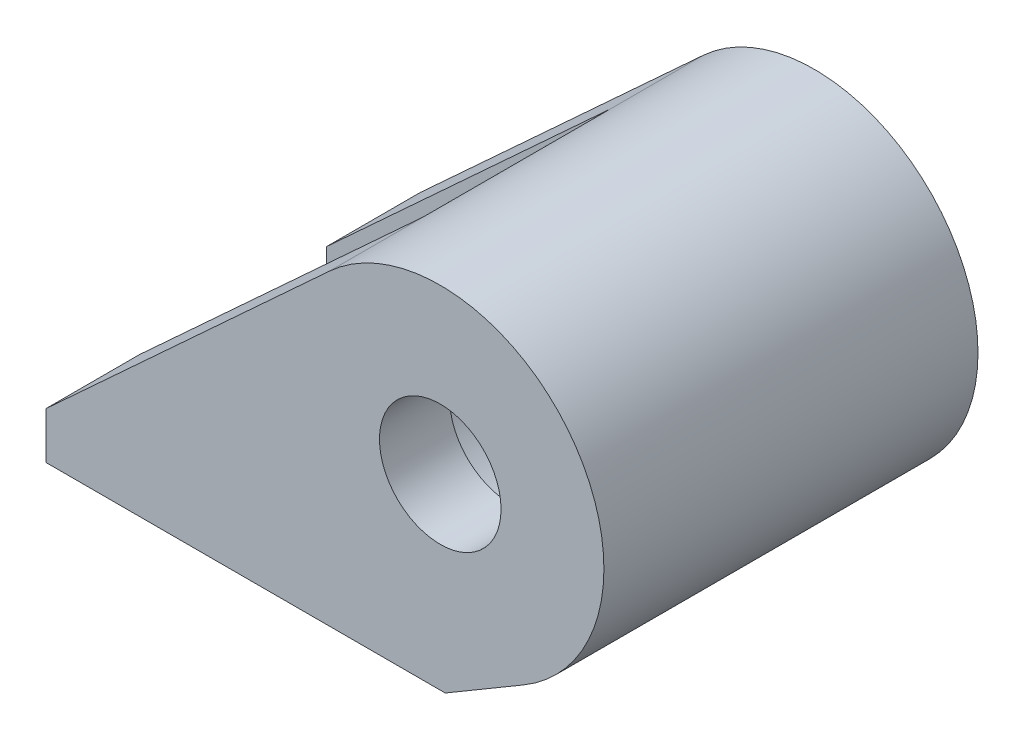
ISO-10303-21;
HEADER;
FILE_DESCRIPTION(('STEP AP214'),'2;1');
FILE_NAME('part.step','',(''),(''),'','','');
FILE_SCHEMA(('AUTOMOTIVE_DESIGN { 1 0 10303 214 1 1 1 1 }'));
ENDSEC;
DATA;
#1=APPLICATION_CONTEXT('core data for automotive mechanical design processes');
#2=APPLICATION_PROTOCOL_DEFINITION('international standard','automotive_design',2000,#1);
#3=PRODUCT_CONTEXT('',#1,'mechanical');
#4=PRODUCT('Part','Part','',(#3));
#5=PRODUCT_RELATED_PRODUCT_CATEGORY('part','',(#4));
#6=PRODUCT_DEFINITION_FORMATION('','',#4);
#7=PRODUCT_DEFINITION_CONTEXT('part definition',#1,'design');
#8=PRODUCT_DEFINITION('design','',#6,#7);
#9=PRODUCT_DEFINITION_SHAPE('','',#8);
#10=(LENGTH_UNIT() NAMED_UNIT(*) SI_UNIT(.MILLI.,.METRE.));
#11=(NAMED_UNIT(*) PLANE_ANGLE_UNIT() SI_UNIT($,.RADIAN.));
#12=(NAMED_UNIT(*) SI_UNIT($,.STERADIAN.) SOLID_ANGLE_UNIT());
#13=UNCERTAINTY_MEASURE_WITH_UNIT(LENGTH_MEASURE(1.E-05),#10,'distance_accuracy_value','');
#14=(GEOMETRIC_REPRESENTATION_CONTEXT(3) GLOBAL_UNCERTAINTY_ASSIGNED_CONTEXT((#13)) GLOBAL_UNIT_ASSIGNED_CONTEXT((#10,
#11,#12)) REPRESENTATION_CONTEXT('',''));
#15=CARTESIAN_POINT('',(0.,0.,0.));
#16=DIRECTION('',(0.,0.,1.));
#17=DIRECTION('',(1.,0.,0.));
#18=AXIS2_PLACEMENT_3D('',#15,#16,#17);
#19=CARTESIAN_POINT('',(0.,0.,15.));
#20=DIRECTION('',(0.,0.,1.));
#21=DIRECTION('',(1.,0.,0.));
#22=AXIS2_PLACEMENT_3D('',#19,#20,#21);
#23=CYLINDRICAL_SURFACE('',#22,25.);
#24=CARTESIAN_POINT('',(0.,0.,15.));
#25=DIRECTION('',(0.,0.,1.));
#26=DIRECTION('',(1.,0.,0.));
#27=AXIS2_PLACEMENT_3D('',#24,#25,#26);
#28=CIRCLE('',#27,25.);
#29=CARTESIAN_POINT('',(5.68557749527452,-24.3449010789781,15.));
#30=VERTEX_POINT('',#29);
#31=CARTESIAN_POINT('',(5.68557749527452,24.3449010789781,15.));
#32=VERTEX_POINT('',#31);
#33=EDGE_CURVE('E307',#30,#32,#28,.T.);
#34=ORIENTED_EDGE('',*,*,#33,.F.);
#35=DIRECTION('',(0.,0.,1.));
#36=VECTOR('',#35,1.);
#37=CARTESIAN_POINT('',(5.68557749527452,-24.3449010789781,15.));
#38=LINE('',#37,#36);
#39=CARTESIAN_POINT('',(5.68557749527452,-24.3449010789781,65.));
#40=VERTEX_POINT('',#39);
#41=EDGE_CURVE('E263',#30,#40,#38,.T.);
#42=ORIENTED_EDGE('',*,*,#41,.T.);
#43=CARTESIAN_POINT('',(0.,0.,65.));
#44=DIRECTION('',(0.,0.,1.));
#45=DIRECTION('',(1.,0.,0.));
#46=AXIS2_PLACEMENT_3D('',#43,#44,#45);
#47=CIRCLE('',#46,25.);
#48=CARTESIAN_POINT('',(5.68557749527452,24.3449010789781,65.));
#49=VERTEX_POINT('',#48);
#50=EDGE_CURVE('E237',#40,#49,#47,.T.);
#51=ORIENTED_EDGE('',*,*,#50,.T.);
#52=DIRECTION('',(0.,0.,1.));
#53=VECTOR('',#52,1.);
#54=CARTESIAN_POINT('',(5.68557749527452,24.3449010789781,15.));
#55=LINE('',#54,#53);
#56=EDGE_CURVE('E291',#32,#49,#55,.T.);
#57=ORIENTED_EDGE('',*,*,#56,.F.);
#58=EDGE_LOOP('',(#34,#42,#51,#57));
#59=FACE_BOUND('',#58,.T.);
#60=ADVANCED_FACE('F39',(#59),#23,.F.);
#61=CARTESIAN_POINT('',(-4.31442250472548,24.6249011866184,65.));
#62=VERTEX_POINT('',#61);
#63=CARTESIAN_POINT('',(-4.31442250472548,-24.6249011866184,65.));
#64=VERTEX_POINT('',#63);
#65=EDGE_CURVE('E308',#62,#64,#47,.T.);
#66=ORIENTED_EDGE('',*,*,#65,.T.);
#67=DIRECTION('',(0.,0.,1.));
#68=VECTOR('',#67,1.);
#69=CARTESIAN_POINT('',(-4.31442250472548,-24.6249011866184,15.));
#70=LINE('',#69,#68);
#71=CARTESIAN_POINT('',(-4.31442250472548,-24.6249011866184,15.));
#72=VERTEX_POINT('',#71);
#73=EDGE_CURVE('E259',#64,#72,#70,.F.);
#74=ORIENTED_EDGE('',*,*,#73,.T.);
#75=CARTESIAN_POINT('',(-4.31442250472548,24.6249011866184,15.));
#76=VERTEX_POINT('',#75);
#77=EDGE_CURVE('E303',#76,#72,#28,.T.);
#78=ORIENTED_EDGE('',*,*,#77,.F.);
#79=DIRECTION('',(0.,0.,1.));
#80=VECTOR('',#79,1.);
#81=CARTESIAN_POINT('',(-4.31442250472548,24.6249011866184,15.));
#82=LINE('',#81,#80);
#83=EDGE_CURVE('E288',#62,#76,#82,.F.);
#84=ORIENTED_EDGE('',*,*,#83,.F.);
#85=EDGE_LOOP('',(#66,#74,#78,#84));
#86=FACE_BOUND('',#85,.T.);
#87=ADVANCED_FACE('F547',(#86),#23,.F.);
#88=CARTESIAN_POINT('',(0.,0.,15.));
#89=DIRECTION('',(0.,0.,1.));
#90=DIRECTION('',(1.,0.,0.));
#91=AXIS2_PLACEMENT_3D('',#88,#89,#90);
#92=PLANE('',#91);
#93=DIRECTION('',(0.,1.,0.));
#94=VECTOR('',#93,1.);
#95=CARTESIAN_POINT('',(5.68557749527452,-35.,15.));
#96=LINE('',#95,#94);
#97=CARTESIAN_POINT('',(5.68557749527452,-15.,15.));
#98=VERTEX_POINT('',#97);
#99=EDGE_CURVE('E243',#30,#98,#96,.T.);
#100=ORIENTED_EDGE('',*,*,#99,.F.);
#101=ORIENTED_EDGE('',*,*,#33,.T.);
#102=DIRECTION('',(0.,-1.,0.));
#103=VECTOR('',#102,1.);
#104=CARTESIAN_POINT('',(5.68557749527452,31.,15.));
#105=LINE('',#104,#103);
#106=CARTESIAN_POINT('',(5.68557749527452,15.,15.));
#107=VERTEX_POINT('',#106);
#108=EDGE_CURVE('E284',#32,#107,#105,.T.);
#109=ORIENTED_EDGE('',*,*,#108,.T.);
#110=DIRECTION('',(-1.,0.,0.));
#111=VECTOR('',#110,1.);
#112=CARTESIAN_POINT('',(-4.31442250472548,15.,15.));
#113=LINE('',#112,#111);
#114=CARTESIAN_POINT('',(-4.31442250472548,15.,15.));
#115=VERTEX_POINT('',#114);
#116=EDGE_CURVE('E270',#107,#115,#113,.T.);
#117=ORIENTED_EDGE('',*,*,#116,.T.);
#118=DIRECTION('',(0.,-1.,0.));
#119=VECTOR('',#118,1.);
#120=CARTESIAN_POINT('',(-4.31442250472548,31.,15.));
#121=LINE('',#120,#119);
#122=EDGE_CURVE('E281',#76,#115,#121,.T.);
#123=ORIENTED_EDGE('',*,*,#122,.F.);
#124=ORIENTED_EDGE('',*,*,#77,.T.);
#125=DIRECTION('',(0.,1.,0.));
#126=VECTOR('',#125,1.);
#127=CARTESIAN_POINT('',(-4.31442250472548,-35.,15.));
#128=LINE('',#127,#126);
#129=CARTESIAN_POINT('',(-4.31442250472548,-15.,15.));
#130=VERTEX_POINT('',#129);
#131=EDGE_CURVE('E60',#72,#130,#128,.T.);
#132=ORIENTED_EDGE('',*,*,#131,.T.);
#133=DIRECTION('',(-1.,0.,0.));
#134=VECTOR('',#133,1.);
#135=CARTESIAN_POINT('',(-4.31442250472548,-15.,15.));
#136=LINE('',#135,#134);
#137=EDGE_CURVE('E55',#98,#130,#136,.T.);
#138=ORIENTED_EDGE('',*,*,#137,.F.);
#139=EDGE_LOOP('',(#100,#101,#109,#117,#123,#124,#132,#138));
#140=FACE_BOUND('',#139,.T.);
#141=CARTESIAN_POINT('',(0.,0.,15.));
#142=DIRECTION('',(0.,0.,1.));
#143=DIRECTION('',(1.,0.,0.));
#144=AXIS2_PLACEMENT_3D('',#141,#142,#143);
#145=CIRCLE('',#144,13.);
#146=CARTESIAN_POINT('',(13.,0.,15.));
#147=VERTEX_POINT('',#146);
#148=EDGE_CURVE('E295',#147,#147,#145,.T.);
#149=ORIENTED_EDGE('',*,*,#148,.F.);
#150=EDGE_LOOP('',(#149));
#151=FACE_BOUND('',#150,.T.);
#152=ADVANCED_FACE('F567',(#140,#151),#92,.T.);
#153=CARTESIAN_POINT('',(0.,0.,65.));
#154=DIRECTION('',(0.,0.,1.));
#155=DIRECTION('',(1.,0.,0.));
#156=AXIS2_PLACEMENT_3D('',#153,#154,#155);
#157=PLANE('',#156);
#158=ORIENTED_EDGE('',*,*,#50,.F.);
#159=DIRECTION('',(0.,1.,0.));
#160=VECTOR('',#159,1.);
#161=CARTESIAN_POINT('',(5.68557749527452,0.,65.));
#162=LINE('',#161,#160);
#163=CARTESIAN_POINT('',(5.68557749527452,-15.,65.));
#164=VERTEX_POINT('',#163);
#165=EDGE_CURVE('E11',#40,#164,#162,.T.);
#166=ORIENTED_EDGE('',*,*,#165,.T.);
#167=DIRECTION('',(1.,0.,0.));
#168=VECTOR('',#167,1.);
#169=CARTESIAN_POINT('',(-4.31442250472548,-15.,65.));
#170=LINE('',#169,#168);
#171=CARTESIAN_POINT('',(-4.31442250472548,-15.,65.));
#172=VERTEX_POINT('',#171);
#173=EDGE_CURVE('E234',#172,#164,#170,.T.);
#174=ORIENTED_EDGE('',*,*,#173,.F.);
#175=DIRECTION('',(0.,-1.,0.));
#176=VECTOR('',#175,1.);
#177=CARTESIAN_POINT('',(-4.31442250472548,0.,65.));
#178=LINE('',#177,#176);
#179=EDGE_CURVE('E48',#172,#64,#178,.T.);
#180=ORIENTED_EDGE('',*,*,#179,.T.);
#181=ORIENTED_EDGE('',*,*,#65,.F.);
#182=DIRECTION('',(0.,1.,0.));
#183=VECTOR('',#182,1.);
#184=CARTESIAN_POINT('',(-4.31442250472548,0.,65.));
#185=LINE('',#184,#183);
#186=CARTESIAN_POINT('',(-4.31442250472548,15.,65.));
#187=VERTEX_POINT('',#186);
#188=EDGE_CURVE('E534',#187,#62,#185,.T.);
#189=ORIENTED_EDGE('',*,*,#188,.F.);
#190=DIRECTION('',(1.,0.,0.));
#191=VECTOR('',#190,1.);
#192=CARTESIAN_POINT('',(-4.31442250472548,15.,65.));
#193=LINE('',#192,#191);
#194=CARTESIAN_POINT('',(5.68557749527452,15.,65.));
#195=VERTEX_POINT('',#194);
#196=EDGE_CURVE('E277',#187,#195,#193,.T.);
#197=ORIENTED_EDGE('',*,*,#196,.T.);
#198=DIRECTION('',(0.,-1.,0.));
#199=VECTOR('',#198,1.);
#200=CARTESIAN_POINT('',(5.68557749527452,0.,65.));
#201=LINE('',#200,#199);
#202=EDGE_CURVE('E537',#49,#195,#201,.T.);
#203=ORIENTED_EDGE('',*,*,#202,.F.);
#204=EDGE_LOOP('',(#158,#166,#174,#180,#181,#189,#197,#203));
#205=FACE_BOUND('',#204,.T.);
#206=CARTESIAN_POINT('',(0.,0.,65.));
#207=DIRECTION('',(0.,0.,1.));
#208=DIRECTION('',(1.,0.,0.));
#209=AXIS2_PLACEMENT_3D('',#206,#207,#208);
#210=CIRCLE('',#209,13.);
#211=CARTESIAN_POINT('',(13.,0.,65.));
#212=VERTEX_POINT('',#211);
#213=EDGE_CURVE('E306',#212,#212,#210,.T.);
#214=ORIENTED_EDGE('',*,*,#213,.T.);
#215=EDGE_LOOP('',(#214));
#216=FACE_BOUND('',#215,.T.);
#217=ADVANCED_FACE('F231',(#205,#216),#157,.F.);
#218=CARTESIAN_POINT('',(-84.3144225047255,-40.,20.));
#219=DIRECTION('',(0.,0.,-1.));
#220=DIRECTION('',(-1.,0.,0.));
#221=AXIS2_PLACEMENT_3D('',#218,#219,#220);
#222=PLANE('',#221);
#223=DIRECTION('',(-1.,0.,0.));
#224=VECTOR('',#223,1.);
#225=CARTESIAN_POINT('',(-64.3144225047255,-24.,20.));
#226=LINE('',#225,#224);
#227=CARTESIAN_POINT('',(-38.,-24.,20.));
#228=VERTEX_POINT('',#227);
#229=CARTESIAN_POINT('',(-64.3144225047255,-24.,20.));
#230=VERTEX_POINT('',#229);
#231=EDGE_CURVE('E383',#228,#230,#226,.T.);
#232=ORIENTED_EDGE('',*,*,#231,.F.);
#233=CARTESIAN_POINT('',(-38.,-21.,20.));
#234=DIRECTION('',(0.,0.,-1.));
#235=DIRECTION('',(-1.,0.,0.));
#236=AXIS2_PLACEMENT_3D('',#233,#234,#235);
#237=CIRCLE('',#236,3.);
#238=CARTESIAN_POINT('',(-35.,-21.,20.));
#239=VERTEX_POINT('',#238);
#240=EDGE_CURVE('E525',#228,#239,#237,.F.);
#241=ORIENTED_EDGE('',*,*,#240,.T.);
#242=DIRECTION('',(0.,-1.,0.));
#243=VECTOR('',#242,1.);
#244=CARTESIAN_POINT('',(-35.,-40.,20.));
#245=LINE('',#244,#243);
#246=CARTESIAN_POINT('',(-35.,0.,20.));
#247=VERTEX_POINT('',#246);
#248=EDGE_CURVE('E327',#247,#239,#245,.T.);
#249=ORIENTED_EDGE('',*,*,#248,.F.);
#250=CARTESIAN_POINT('',(0.,0.,20.));
#251=DIRECTION('',(0.,0.,-1.));
#252=DIRECTION('',(-1.,0.,0.));
#253=AXIS2_PLACEMENT_3D('',#250,#251,#252);
#254=CIRCLE('',#253,35.);
#255=CARTESIAN_POINT('',(-23.6945704185339,25.7598007112078,20.));
#256=VERTEX_POINT('',#255);
#257=EDGE_CURVE('E323',#256,#247,#254,.F.);
#258=ORIENTED_EDGE('',*,*,#257,.F.);
#259=DIRECTION('',(0.735994306034508,0.676987726243824,0.));
#260=VECTOR('',#259,1.);
#261=CARTESIAN_POINT('',(-84.3144225047255,-30.,20.));
#262=LINE('',#261,#260);
#263=CARTESIAN_POINT('',(-84.3144225047255,-30.,20.));
#264=VERTEX_POINT('',#263);
#265=EDGE_CURVE('E445',#264,#256,#262,.T.);
#266=ORIENTED_EDGE('',*,*,#265,.F.);
#267=DIRECTION('',(0.,1.,0.));
#268=VECTOR('',#267,1.);
#269=CARTESIAN_POINT('',(-84.3144225047255,-40.,20.));
#270=LINE('',#269,#268);
#271=CARTESIAN_POINT('',(-84.3144225047255,-40.,20.));
#272=VERTEX_POINT('',#271);
#273=EDGE_CURVE('E427',#272,#264,#270,.T.);
#274=ORIENTED_EDGE('',*,*,#273,.F.);
#275=DIRECTION('',(-1.,0.,0.));
#276=VECTOR('',#275,1.);
#277=CARTESIAN_POINT('',(-84.3144225047255,-40.,20.));
#278=LINE('',#277,#276);
#279=CARTESIAN_POINT('',(-64.3144225047255,-40.,20.));
#280=VERTEX_POINT('',#279);
#281=EDGE_CURVE('E422',#280,#272,#278,.T.);
#282=ORIENTED_EDGE('',*,*,#281,.F.);
#283=DIRECTION('',(0.,1.,0.));
#284=VECTOR('',#283,1.);
#285=CARTESIAN_POINT('',(-64.3144225047255,-40.,20.));
#286=LINE('',#285,#284);
#287=EDGE_CURVE('E432',#280,#230,#286,.T.);
#288=ORIENTED_EDGE('',*,*,#287,.T.);
#289=EDGE_LOOP('',(#232,#241,#249,#258,#266,#274,#282,#288));
#290=FACE_BOUND('',#289,.T.);
#291=ADVANCED_FACE('F613',(#290),#222,.F.);
#292=CARTESIAN_POINT('',(-84.3144225047255,-40.,60.));
#293=DIRECTION('',(0.,0.,1.));
#294=DIRECTION('',(1.,0.,0.));
#295=AXIS2_PLACEMENT_3D('',#292,#293,#294);
#296=PLANE('',#295);
#297=DIRECTION('',(0.,-1.,0.));
#298=VECTOR('',#297,1.);
#299=CARTESIAN_POINT('',(-35.,0.,60.));
#300=LINE('',#299,#298);
#301=CARTESIAN_POINT('',(-35.,0.,60.));
#302=VERTEX_POINT('',#301);
#303=CARTESIAN_POINT('',(-35.,-21.,60.));
#304=VERTEX_POINT('',#303);
#305=EDGE_CURVE('E315',#302,#304,#300,.T.);
#306=ORIENTED_EDGE('',*,*,#305,.T.);
#307=CARTESIAN_POINT('',(-38.,-21.,60.));
#308=DIRECTION('',(0.,0.,1.));
#309=DIRECTION('',(1.,0.,0.));
#310=AXIS2_PLACEMENT_3D('',#307,#308,#309);
#311=CIRCLE('',#310,3.);
#312=CARTESIAN_POINT('',(-38.,-24.,60.));
#313=VERTEX_POINT('',#312);
#314=EDGE_CURVE('E531',#304,#313,#311,.F.);
#315=ORIENTED_EDGE('',*,*,#314,.T.);
#316=DIRECTION('',(1.,0.,0.));
#317=VECTOR('',#316,1.);
#318=CARTESIAN_POINT('',(-64.3144225047255,-24.,60.));
#319=LINE('',#318,#317);
#320=CARTESIAN_POINT('',(-64.3144225047255,-24.,60.));
#321=VERTEX_POINT('',#320);
#322=EDGE_CURVE('E379',#321,#313,#319,.T.);
#323=ORIENTED_EDGE('',*,*,#322,.F.);
#324=DIRECTION('',(0.,1.,0.));
#325=VECTOR('',#324,1.);
#326=CARTESIAN_POINT('',(-64.3144225047255,-40.,60.));
#327=LINE('',#326,#325);
#328=CARTESIAN_POINT('',(-64.3144225047255,-40.,60.));
#329=VERTEX_POINT('',#328);
#330=EDGE_CURVE('E436',#329,#321,#327,.T.);
#331=ORIENTED_EDGE('',*,*,#330,.F.);
#332=DIRECTION('',(1.,0.,0.));
#333=VECTOR('',#332,1.);
#334=CARTESIAN_POINT('',(-84.3144225047255,-40.,60.));
#335=LINE('',#334,#333);
#336=CARTESIAN_POINT('',(-84.3144225047255,-40.,60.));
#337=VERTEX_POINT('',#336);
#338=EDGE_CURVE('E413',#337,#329,#335,.T.);
#339=ORIENTED_EDGE('',*,*,#338,.F.);
#340=DIRECTION('',(0.,1.,0.));
#341=VECTOR('',#340,1.);
#342=CARTESIAN_POINT('',(-84.3144225047255,-40.,60.));
#343=LINE('',#342,#341);
#344=CARTESIAN_POINT('',(-84.3144225047255,-30.,60.));
#345=VERTEX_POINT('',#344);
#346=EDGE_CURVE('E426',#337,#345,#343,.T.);
#347=ORIENTED_EDGE('',*,*,#346,.T.);
#348=DIRECTION('',(-0.735994306034508,-0.676987726243824,0.));
#349=VECTOR('',#348,1.);
#350=CARTESIAN_POINT('',(-84.3144225047255,-30.,60.));
#351=LINE('',#350,#349);
#352=CARTESIAN_POINT('',(-23.6945704185339,25.7598007112078,60.));
#353=VERTEX_POINT('',#352);
#354=EDGE_CURVE('E431',#353,#345,#351,.T.);
#355=ORIENTED_EDGE('',*,*,#354,.F.);
#356=CARTESIAN_POINT('',(0.,0.,60.));
#357=DIRECTION('',(0.,0.,1.));
#358=DIRECTION('',(1.,0.,0.));
#359=AXIS2_PLACEMENT_3D('',#356,#357,#358);
#360=CIRCLE('',#359,35.);
#361=EDGE_CURVE('E312',#353,#302,#360,.T.);
#362=ORIENTED_EDGE('',*,*,#361,.T.);
#363=EDGE_LOOP('',(#306,#315,#323,#331,#339,#347,#355,#362));
#364=FACE_BOUND('',#363,.T.);
#365=ADVANCED_FACE('F611',(#364),#296,.F.);
#366=CARTESIAN_POINT('',(-55.,-24.,40.));
#367=DIRECTION('',(0.,1.,0.));
#368=DIRECTION('',(0.,0.,1.));
#369=AXIS2_PLACEMENT_3D('',#366,#367,#368);
#370=PLANE('',#369);
#371=ORIENTED_EDGE('',*,*,#322,.T.);
#372=DIRECTION('',(0.,0.,-1.));
#373=VECTOR('',#372,1.);
#374=CARTESIAN_POINT('',(-38.,-24.,40.));
#375=LINE('',#374,#373);
#376=EDGE_CURVE('E521',#313,#228,#375,.T.);
#377=ORIENTED_EDGE('',*,*,#376,.T.);
#378=ORIENTED_EDGE('',*,*,#231,.T.);
#379=DIRECTION('',(0.,0.,1.));
#380=VECTOR('',#379,1.);
#381=CARTESIAN_POINT('',(-64.3144225047255,-24.,20.));
#382=LINE('',#381,#380);
#383=CARTESIAN_POINT('',(-64.3144225047255,-24.,25.));
#384=VERTEX_POINT('',#383);
#385=EDGE_CURVE('E514',#230,#384,#382,.T.);
#386=ORIENTED_EDGE('',*,*,#385,.T.);
#387=DIRECTION('',(-1.,0.,0.));
#388=VECTOR('',#387,1.);
#389=CARTESIAN_POINT('',(-55.,-24.,25.));
#390=LINE('',#389,#388);
#391=CARTESIAN_POINT('',(-55.,-24.,25.));
#392=VERTEX_POINT('',#391);
#393=EDGE_CURVE('E348',#392,#384,#390,.T.);
#394=ORIENTED_EDGE('',*,*,#393,.F.);
#395=CARTESIAN_POINT('',(-55.,-24.,40.));
#396=DIRECTION('',(0.,1.,0.));
#397=DIRECTION('',(0.,0.,1.));
#398=AXIS2_PLACEMENT_3D('',#395,#396,#397);
#399=CIRCLE('',#398,15.);
#400=CARTESIAN_POINT('',(-55.,-24.,55.));
#401=VERTEX_POINT('',#400);
#402=EDGE_CURVE('E331',#401,#392,#399,.T.);
#403=ORIENTED_EDGE('',*,*,#402,.F.);
#404=DIRECTION('',(1.,0.,0.));
#405=VECTOR('',#404,1.);
#406=CARTESIAN_POINT('',(-55.,-24.,55.));
#407=LINE('',#406,#405);
#408=CARTESIAN_POINT('',(-64.3144225047255,-24.,55.));
#409=VERTEX_POINT('',#408);
#410=EDGE_CURVE('E337',#409,#401,#407,.T.);
#411=ORIENTED_EDGE('',*,*,#410,.F.);
#412=EDGE_CURVE('E513',#409,#321,#382,.T.);
#413=ORIENTED_EDGE('',*,*,#412,.T.);
#414=EDGE_LOOP('',(#371,#377,#378,#386,#394,#403,#411,#413));
#415=FACE_BOUND('',#414,.T.);
#416=ADVANCED_FACE('F607',(#415),#370,.T.);
#417=CARTESIAN_POINT('',(-84.3144225047255,-30.,80.));
#418=DIRECTION('',(0.676987726243824,-0.735994306034508,0.));
#419=DIRECTION('',(0.735994306034508,0.676987726243824,0.));
#420=AXIS2_PLACEMENT_3D('',#417,#418,#419);
#421=PLANE('',#420);
#422=DIRECTION('',(0.,0.,-1.));
#423=VECTOR('',#422,1.);
#424=CARTESIAN_POINT('',(-23.6945704185339,25.7598007112078,80.));
#425=LINE('',#424,#423);
#426=CARTESIAN_POINT('',(-23.6945704185339,25.7598007112078,80.));
#427=VERTEX_POINT('',#426);
#428=EDGE_CURVE('E509',#427,#353,#425,.T.);
#429=ORIENTED_EDGE('',*,*,#428,.T.);
#430=ORIENTED_EDGE('',*,*,#354,.T.);
#431=DIRECTION('',(0.,0.,-1.));
#432=VECTOR('',#431,1.);
#433=CARTESIAN_POINT('',(-84.3144225047255,-30.,80.));
#434=LINE('',#433,#432);
#435=CARTESIAN_POINT('',(-84.3144225047255,-30.,80.));
#436=VERTEX_POINT('',#435);
#437=EDGE_CURVE('E504',#436,#345,#434,.T.);
#438=ORIENTED_EDGE('',*,*,#437,.F.);
#439=DIRECTION('',(-0.735994306034508,-0.676987726243824,0.));
#440=VECTOR('',#439,1.);
#441=CARTESIAN_POINT('',(-84.3144225047255,-30.,80.));
#442=LINE('',#441,#440);
#443=EDGE_CURVE('E461',#427,#436,#442,.T.);
#444=ORIENTED_EDGE('',*,*,#443,.F.);
#445=EDGE_LOOP('',(#429,#430,#438,#444));
#446=FACE_BOUND('',#445,.T.);
#447=ADVANCED_FACE('F610',(#446),#421,.F.);
#448=ORIENTED_EDGE('',*,*,#265,.T.);
#449=CARTESIAN_POINT('',(-23.6945704185339,25.7598007112078,0.));
#450=VERTEX_POINT('',#449);
#451=EDGE_CURVE('E508',#256,#450,#425,.T.);
#452=ORIENTED_EDGE('',*,*,#451,.T.);
#453=DIRECTION('',(-0.735994306034508,-0.676987726243824,0.));
#454=VECTOR('',#453,1.);
#455=CARTESIAN_POINT('',(-84.3144225047255,-30.,0.));
#456=LINE('',#455,#454);
#457=CARTESIAN_POINT('',(-84.3144225047255,-30.,0.));
#458=VERTEX_POINT('',#457);
#459=EDGE_CURVE('E478',#450,#458,#456,.T.);
#460=ORIENTED_EDGE('',*,*,#459,.T.);
#461=EDGE_CURVE('E503',#264,#458,#434,.T.);
#462=ORIENTED_EDGE('',*,*,#461,.F.);
#463=EDGE_LOOP('',(#448,#452,#460,#462));
#464=FACE_BOUND('',#463,.T.);
#465=ADVANCED_FACE('F597',(#464),#421,.F.);
#466=CARTESIAN_POINT('',(-55.,-40.,48.));
#467=DIRECTION('',(0.,0.,1.));
#468=DIRECTION('',(1.,0.,0.));
#469=AXIS2_PLACEMENT_3D('',#466,#467,#468);
#470=PLANE('',#469);
#471=DIRECTION('',(-1.,0.,0.));
#472=VECTOR('',#471,1.);
#473=CARTESIAN_POINT('',(-55.,-30.,48.));
#474=LINE('',#473,#472);
#475=CARTESIAN_POINT('',(-55.,-30.,48.));
#476=VERTEX_POINT('',#475);
#477=CARTESIAN_POINT('',(-64.3144225047255,-30.,48.));
#478=VERTEX_POINT('',#477);
#479=EDGE_CURVE('E362',#476,#478,#474,.T.);
#480=ORIENTED_EDGE('',*,*,#479,.F.);
#481=DIRECTION('',(0.,1.,0.));
#482=VECTOR('',#481,1.);
#483=CARTESIAN_POINT('',(-55.,-40.,48.));
#484=LINE('',#483,#482);
#485=CARTESIAN_POINT('',(-55.,-40.,48.));
#486=VERTEX_POINT('',#485);
#487=EDGE_CURVE('E399',#486,#476,#484,.T.);
#488=ORIENTED_EDGE('',*,*,#487,.F.);
#489=DIRECTION('',(1.,0.,0.));
#490=VECTOR('',#489,1.);
#491=CARTESIAN_POINT('',(-55.,-40.,48.));
#492=LINE('',#491,#490);
#493=CARTESIAN_POINT('',(-64.3144225047255,-40.,48.));
#494=VERTEX_POINT('',#493);
#495=EDGE_CURVE('E394',#494,#486,#492,.T.);
#496=ORIENTED_EDGE('',*,*,#495,.F.);
#497=DIRECTION('',(0.,-1.,0.));
#498=VECTOR('',#497,1.);
#499=CARTESIAN_POINT('',(-64.3144225047255,-40.,48.));
#500=LINE('',#499,#498);
#501=EDGE_CURVE('E410',#478,#494,#500,.T.);
#502=ORIENTED_EDGE('',*,*,#501,.F.);
#503=EDGE_LOOP('',(#480,#488,#496,#502));
#504=FACE_BOUND('',#503,.T.);
#505=ADVANCED_FACE('F593',(#504),#470,.F.);
#506=CARTESIAN_POINT('',(-92.7334325278807,-40.,32.));
#507=DIRECTION('',(0.,0.,-1.));
#508=DIRECTION('',(-1.,0.,0.));
#509=AXIS2_PLACEMENT_3D('',#506,#507,#508);
#510=PLANE('',#509);
#511=DIRECTION('',(1.,0.,0.));
#512=VECTOR('',#511,1.);
#513=CARTESIAN_POINT('',(-92.7334325278807,-30.,32.));
#514=LINE('',#513,#512);
#515=CARTESIAN_POINT('',(-64.3144225047255,-30.,32.));
#516=VERTEX_POINT('',#515);
#517=CARTESIAN_POINT('',(-55.,-30.,32.));
#518=VERTEX_POINT('',#517);
#519=EDGE_CURVE('E357',#516,#518,#514,.T.);
#520=ORIENTED_EDGE('',*,*,#519,.F.);
#521=DIRECTION('',(0.,1.,0.));
#522=VECTOR('',#521,1.);
#523=CARTESIAN_POINT('',(-64.3144225047255,-40.,32.));
#524=LINE('',#523,#522);
#525=CARTESIAN_POINT('',(-64.3144225047255,-40.,32.));
#526=VERTEX_POINT('',#525);
#527=EDGE_CURVE('E403',#526,#516,#524,.T.);
#528=ORIENTED_EDGE('',*,*,#527,.F.);
#529=DIRECTION('',(-1.,0.,0.));
#530=VECTOR('',#529,1.);
#531=CARTESIAN_POINT('',(-92.7334325278807,-40.,32.));
#532=LINE('',#531,#530);
#533=CARTESIAN_POINT('',(-55.,-40.,32.));
#534=VERTEX_POINT('',#533);
#535=EDGE_CURVE('E390',#534,#526,#532,.T.);
#536=ORIENTED_EDGE('',*,*,#535,.F.);
#537=DIRECTION('',(0.,1.,0.));
#538=VECTOR('',#537,1.);
#539=CARTESIAN_POINT('',(-55.,-40.,32.));
#540=LINE('',#539,#538);
#541=EDGE_CURVE('E398',#534,#518,#540,.T.);
#542=ORIENTED_EDGE('',*,*,#541,.T.);
#543=EDGE_LOOP('',(#520,#528,#536,#542));
#544=FACE_BOUND('',#543,.T.);
#545=ADVANCED_FACE('F596',(#544),#510,.F.);
#546=CARTESIAN_POINT('',(-55.,-40.,40.));
#547=DIRECTION('',(0.,1.,0.));
#548=DIRECTION('',(0.,0.,1.));
#549=AXIS2_PLACEMENT_3D('',#546,#547,#548);
#550=CYLINDRICAL_SURFACE('',#549,8.);
#551=CARTESIAN_POINT('',(-55.,-30.,40.));
#552=DIRECTION('',(0.,1.,0.));
#553=DIRECTION('',(0.,0.,1.));
#554=AXIS2_PLACEMENT_3D('',#551,#552,#553);
#555=CIRCLE('',#554,8.);
#556=EDGE_CURVE('E518',#518,#476,#555,.F.);
#557=ORIENTED_EDGE('',*,*,#556,.F.);
#558=ORIENTED_EDGE('',*,*,#541,.F.);
#559=CARTESIAN_POINT('',(-55.,-40.,40.));
#560=DIRECTION('',(0.,1.,0.));
#561=DIRECTION('',(0.,0.,1.));
#562=AXIS2_PLACEMENT_3D('',#559,#560,#561);
#563=CIRCLE('',#562,8.);
#564=EDGE_CURVE('E386',#486,#534,#563,.T.);
#565=ORIENTED_EDGE('',*,*,#564,.F.);
#566=ORIENTED_EDGE('',*,*,#487,.T.);
#567=EDGE_LOOP('',(#557,#558,#565,#566));
#568=FACE_BOUND('',#567,.T.);
#569=ADVANCED_FACE('F601',(#568),#550,.F.);
#570=CARTESIAN_POINT('',(-64.3144225047255,-40.,20.));
#571=DIRECTION('',(1.,0.,0.));
#572=DIRECTION('',(0.,0.,-1.));
#573=AXIS2_PLACEMENT_3D('',#570,#571,#572);
#574=PLANE('',#573);
#575=ORIENTED_EDGE('',*,*,#412,.F.);
#576=DIRECTION('',(0.,-1.,0.));
#577=VECTOR('',#576,1.);
#578=CARTESIAN_POINT('',(-64.3144225047255,-40.,55.));
#579=LINE('',#578,#577);
#580=CARTESIAN_POINT('',(-64.3144225047255,-30.,55.));
#581=VERTEX_POINT('',#580);
#582=EDGE_CURVE('E375',#409,#581,#579,.T.);
#583=ORIENTED_EDGE('',*,*,#582,.T.);
#584=DIRECTION('',(0.,0.,1.));
#585=VECTOR('',#584,1.);
#586=CARTESIAN_POINT('',(-64.3144225047255,-30.,20.));
#587=LINE('',#586,#585);
#588=EDGE_CURVE('E368',#478,#581,#587,.T.);
#589=ORIENTED_EDGE('',*,*,#588,.F.);
#590=ORIENTED_EDGE('',*,*,#501,.T.);
#591=DIRECTION('',(0.,0.,-1.));
#592=VECTOR('',#591,1.);
#593=CARTESIAN_POINT('',(-64.3144225047255,-40.,20.));
#594=LINE('',#593,#592);
#595=EDGE_CURVE('E418',#329,#494,#594,.T.);
#596=ORIENTED_EDGE('',*,*,#595,.F.);
#597=ORIENTED_EDGE('',*,*,#330,.T.);
#598=EDGE_LOOP('',(#575,#583,#589,#590,#596,#597));
#599=FACE_BOUND('',#598,.T.);
#600=ADVANCED_FACE('F605',(#599),#574,.F.);
#601=DIRECTION('',(0.,0.,1.));
#602=VECTOR('',#601,1.);
#603=CARTESIAN_POINT('',(-64.3144225047255,-30.,20.));
#604=LINE('',#603,#602);
#605=CARTESIAN_POINT('',(-64.3144225047255,-30.,25.));
#606=VERTEX_POINT('',#605);
#607=EDGE_CURVE('E365',#606,#516,#604,.T.);
#608=ORIENTED_EDGE('',*,*,#607,.F.);
#609=DIRECTION('',(0.,1.,0.));
#610=VECTOR('',#609,1.);
#611=CARTESIAN_POINT('',(-64.3144225047255,-40.,25.));
#612=LINE('',#611,#610);
#613=EDGE_CURVE('E371',#606,#384,#612,.T.);
#614=ORIENTED_EDGE('',*,*,#613,.T.);
#615=ORIENTED_EDGE('',*,*,#385,.F.);
#616=ORIENTED_EDGE('',*,*,#287,.F.);
#617=EDGE_CURVE('E417',#526,#280,#594,.T.);
#618=ORIENTED_EDGE('',*,*,#617,.F.);
#619=ORIENTED_EDGE('',*,*,#527,.T.);
#620=EDGE_LOOP('',(#608,#614,#615,#616,#618,#619));
#621=FACE_BOUND('',#620,.T.);
#622=ADVANCED_FACE('F619',(#621),#574,.F.);
#623=CARTESIAN_POINT('',(-84.3144225047255,-30.,80.));
#624=DIRECTION('',(1.,0.,0.));
#625=DIRECTION('',(0.,0.,-1.));
#626=AXIS2_PLACEMENT_3D('',#623,#624,#625);
#627=PLANE('',#626);
#628=DIRECTION('',(0.,0.,-1.));
#629=VECTOR('',#628,1.);
#630=CARTESIAN_POINT('',(-84.3144225047255,-40.,80.));
#631=LINE('',#630,#629);
#632=CARTESIAN_POINT('',(-84.3144225047255,-40.,0.));
#633=VERTEX_POINT('',#632);
#634=EDGE_CURVE('E498',#272,#633,#631,.T.);
#635=ORIENTED_EDGE('',*,*,#634,.F.);
#636=ORIENTED_EDGE('',*,*,#273,.T.);
#637=ORIENTED_EDGE('',*,*,#461,.T.);
#638=DIRECTION('',(0.,-1.,0.));
#639=VECTOR('',#638,1.);
#640=CARTESIAN_POINT('',(-84.3144225047255,-30.,0.));
#641=LINE('',#640,#639);
#642=EDGE_CURVE('E482',#458,#633,#641,.T.);
#643=ORIENTED_EDGE('',*,*,#642,.T.);
#644=EDGE_LOOP('',(#635,#636,#637,#643));
#645=FACE_BOUND('',#644,.T.);
#646=ADVANCED_FACE('F648',(#645),#627,.F.);
#647=CARTESIAN_POINT('',(0.,0.,80.));
#648=DIRECTION('',(0.,0.,-1.));
#649=DIRECTION('',(-1.,0.,0.));
#650=AXIS2_PLACEMENT_3D('',#647,#648,#649);
#651=CYLINDRICAL_SURFACE('',#650,35.);
#652=DIRECTION('',(0.,0.,-1.));
#653=VECTOR('',#652,1.);
#654=CARTESIAN_POINT('',(17.7692307692308,-30.1538461538461,80.));
#655=LINE('',#654,#653);
#656=CARTESIAN_POINT('',(17.7692307692308,-30.1538461538461,80.));
#657=VERTEX_POINT('',#656);
#658=CARTESIAN_POINT('',(17.7692307692308,-30.1538461538461,0.));
#659=VERTEX_POINT('',#658);
#660=EDGE_CURVE('E474',#657,#659,#655,.T.);
#661=ORIENTED_EDGE('',*,*,#660,.T.);
#662=CARTESIAN_POINT('',(0.,0.,0.));
#663=DIRECTION('',(0.,0.,1.));
#664=DIRECTION('',(1.,0.,0.));
#665=AXIS2_PLACEMENT_3D('',#662,#663,#664);
#666=CIRCLE('',#665,35.);
#667=EDGE_CURVE('E456',#659,#450,#666,.T.);
#668=ORIENTED_EDGE('',*,*,#667,.T.);
#669=ORIENTED_EDGE('',*,*,#451,.F.);
#670=ORIENTED_EDGE('',*,*,#257,.T.);
#671=DIRECTION('',(0.,0.,-1.));
#672=VECTOR('',#671,1.);
#673=CARTESIAN_POINT('',(-35.,0.,60.));
#674=LINE('',#673,#672);
#675=EDGE_CURVE('E319',#302,#247,#674,.T.);
#676=ORIENTED_EDGE('',*,*,#675,.F.);
#677=ORIENTED_EDGE('',*,*,#361,.F.);
#678=ORIENTED_EDGE('',*,*,#428,.F.);
#679=CARTESIAN_POINT('',(0.,0.,80.));
#680=DIRECTION('',(0.,0.,1.));
#681=DIRECTION('',(1.,0.,0.));
#682=AXIS2_PLACEMENT_3D('',#679,#680,#681);
#683=CIRCLE('',#682,35.);
#684=EDGE_CURVE('E457',#657,#427,#683,.T.);
#685=ORIENTED_EDGE('',*,*,#684,.F.);
#686=EDGE_LOOP('',(#661,#668,#669,#670,#676,#677,#678,#685));
#687=FACE_BOUND('',#686,.T.);
#688=ADVANCED_FACE('F646',(#687),#651,.T.);
#689=ORIENTED_EDGE('',*,*,#437,.T.);
#690=ORIENTED_EDGE('',*,*,#346,.F.);
#691=CARTESIAN_POINT('',(-84.3144225047255,-40.,80.));
#692=VERTEX_POINT('',#691);
#693=EDGE_CURVE('E499',#692,#337,#631,.T.);
#694=ORIENTED_EDGE('',*,*,#693,.F.);
#695=DIRECTION('',(0.,-1.,0.));
#696=VECTOR('',#695,1.);
#697=CARTESIAN_POINT('',(-84.3144225047255,-30.,80.));
#698=LINE('',#697,#696);
#699=EDGE_CURVE('E465',#436,#692,#698,.T.);
#700=ORIENTED_EDGE('',*,*,#699,.F.);
#701=EDGE_LOOP('',(#689,#690,#694,#700));
#702=FACE_BOUND('',#701,.T.);
#703=ADVANCED_FACE('F642',(#702),#627,.F.);
#704=CARTESIAN_POINT('',(-84.3144225047255,-40.,80.));
#705=DIRECTION('',(0.,1.,0.));
#706=DIRECTION('',(-1.,0.,0.));
#707=AXIS2_PLACEMENT_3D('',#704,#705,#706);
#708=PLANE('',#707);
#709=ORIENTED_EDGE('',*,*,#595,.T.);
#710=ORIENTED_EDGE('',*,*,#495,.T.);
#711=ORIENTED_EDGE('',*,*,#564,.T.);
#712=ORIENTED_EDGE('',*,*,#535,.T.);
#713=ORIENTED_EDGE('',*,*,#617,.T.);
#714=ORIENTED_EDGE('',*,*,#281,.T.);
#715=ORIENTED_EDGE('',*,*,#634,.T.);
#716=DIRECTION('',(1.,0.,0.));
#717=VECTOR('',#716,1.);
#718=CARTESIAN_POINT('',(-84.3144225047255,-40.,0.));
#719=LINE('',#718,#717);
#720=CARTESIAN_POINT('',(1.0606060606061,-40.,0.));
#721=VERTEX_POINT('',#720);
#722=EDGE_CURVE('E486',#633,#721,#719,.T.);
#723=ORIENTED_EDGE('',*,*,#722,.T.);
#724=DIRECTION('',(0.,0.,-1.));
#725=VECTOR('',#724,1.);
#726=CARTESIAN_POINT('',(1.0606060606061,-40.,80.));
#727=LINE('',#726,#725);
#728=CARTESIAN_POINT('',(1.0606060606061,-40.,80.));
#729=VERTEX_POINT('',#728);
#730=EDGE_CURVE('E494',#729,#721,#727,.T.);
#731=ORIENTED_EDGE('',*,*,#730,.F.);
#732=DIRECTION('',(1.,0.,0.));
#733=VECTOR('',#732,1.);
#734=CARTESIAN_POINT('',(-84.3144225047255,-40.,80.));
#735=LINE('',#734,#733);
#736=EDGE_CURVE('E468',#692,#729,#735,.T.);
#737=ORIENTED_EDGE('',*,*,#736,.F.);
#738=ORIENTED_EDGE('',*,*,#693,.T.);
#739=ORIENTED_EDGE('',*,*,#338,.T.);
#740=EDGE_LOOP('',(#709,#710,#711,#712,#713,#714,#715,#723,#731,#737,#738,#739));
#741=FACE_BOUND('',#740,.T.);
#742=ADVANCED_FACE('F638',(#741),#708,.F.);
#743=CARTESIAN_POINT('',(1.0606060606061,-40.,80.));
#744=DIRECTION('',(-0.507692307692308,0.861538461538461,0.));
#745=DIRECTION('',(-0.861538461538461,-0.507692307692308,0.));
#746=AXIS2_PLACEMENT_3D('',#743,#744,#745);
#747=PLANE('',#746);
#748=DIRECTION('',(0.861538461538461,0.507692307692308,0.));
#749=VECTOR('',#748,1.);
#750=CARTESIAN_POINT('',(1.0606060606061,-40.,0.));
#751=LINE('',#750,#749);
#752=EDGE_CURVE('E462',#721,#659,#751,.T.);
#753=ORIENTED_EDGE('',*,*,#752,.T.);
#754=ORIENTED_EDGE('',*,*,#660,.F.);
#755=DIRECTION('',(0.861538461538461,0.507692307692308,0.));
#756=VECTOR('',#755,1.);
#757=CARTESIAN_POINT('',(1.0606060606061,-40.,80.));
#758=LINE('',#757,#756);
#759=EDGE_CURVE('E471',#729,#657,#758,.T.);
#760=ORIENTED_EDGE('',*,*,#759,.F.);
#761=ORIENTED_EDGE('',*,*,#730,.T.);
#762=EDGE_LOOP('',(#753,#754,#760,#761));
#763=FACE_BOUND('',#762,.T.);
#764=ADVANCED_FACE('F631',(#763),#747,.F.);
#765=CARTESIAN_POINT('',(0.,0.,80.));
#766=DIRECTION('',(0.,0.,1.));
#767=DIRECTION('',(1.,0.,0.));
#768=AXIS2_PLACEMENT_3D('',#765,#766,#767);
#769=PLANE('',#768);
#770=CARTESIAN_POINT('',(0.,0.,80.));
#771=DIRECTION('',(0.,0.,1.));
#772=DIRECTION('',(1.,0.,0.));
#773=AXIS2_PLACEMENT_3D('',#770,#771,#772);
#774=CIRCLE('',#773,13.);
#775=CARTESIAN_POINT('',(13.,0.,80.));
#776=VERTEX_POINT('',#775);
#777=EDGE_CURVE('E449',#776,#776,#774,.T.);
#778=ORIENTED_EDGE('',*,*,#777,.F.);
#779=EDGE_LOOP('',(#778));
#780=FACE_BOUND('',#779,.T.);
#781=ORIENTED_EDGE('',*,*,#684,.T.);
#782=ORIENTED_EDGE('',*,*,#443,.T.);
#783=ORIENTED_EDGE('',*,*,#699,.T.);
#784=ORIENTED_EDGE('',*,*,#736,.T.);
#785=ORIENTED_EDGE('',*,*,#759,.T.);
#786=EDGE_LOOP('',(#781,#782,#783,#784,#785));
#787=FACE_BOUND('',#786,.T.);
#788=ADVANCED_FACE('F628',(#780,#787),#769,.T.);
#789=CARTESIAN_POINT('',(0.,0.,0.));
#790=DIRECTION('',(0.,0.,1.));
#791=DIRECTION('',(1.,0.,0.));
#792=AXIS2_PLACEMENT_3D('',#789,#790,#791);
#793=PLANE('',#792);
#794=CARTESIAN_POINT('',(0.,0.,0.));
#795=DIRECTION('',(0.,0.,1.));
#796=DIRECTION('',(1.,0.,0.));
#797=AXIS2_PLACEMENT_3D('',#794,#795,#796);
#798=CIRCLE('',#797,13.);
#799=CARTESIAN_POINT('',(13.,0.,0.));
#800=VERTEX_POINT('',#799);
#801=EDGE_CURVE('E299',#800,#800,#798,.T.);
#802=ORIENTED_EDGE('',*,*,#801,.T.);
#803=EDGE_LOOP('',(#802));
#804=FACE_BOUND('',#803,.T.);
#805=ORIENTED_EDGE('',*,*,#459,.F.);
#806=ORIENTED_EDGE('',*,*,#667,.F.);
#807=ORIENTED_EDGE('',*,*,#752,.F.);
#808=ORIENTED_EDGE('',*,*,#722,.F.);
#809=ORIENTED_EDGE('',*,*,#642,.F.);
#810=EDGE_LOOP('',(#805,#806,#807,#808,#809));
#811=FACE_BOUND('',#810,.T.);
#812=ADVANCED_FACE('F626',(#804,#811),#793,.F.);
#813=CARTESIAN_POINT('',(0.,0.,65.));
#814=DIRECTION('',(0.,0.,1.));
#815=DIRECTION('',(1.,0.,0.));
#816=AXIS2_PLACEMENT_3D('',#813,#814,#815);
#817=CYLINDRICAL_SURFACE('',#816,13.);
#818=ORIENTED_EDGE('',*,*,#213,.F.);
#819=EDGE_LOOP('',(#818));
#820=FACE_BOUND('',#819,.T.);
#821=ORIENTED_EDGE('',*,*,#777,.T.);
#822=EDGE_LOOP('',(#821));
#823=FACE_BOUND('',#822,.T.);
#824=ADVANCED_FACE('F585',(#820,#823),#817,.F.);
#825=CARTESIAN_POINT('',(-55.,-30.,55.));
#826=DIRECTION('',(0.,0.,1.));
#827=DIRECTION('',(1.,0.,0.));
#828=AXIS2_PLACEMENT_3D('',#825,#826,#827);
#829=PLANE('',#828);
#830=ORIENTED_EDGE('',*,*,#410,.T.);
#831=DIRECTION('',(0.,1.,0.));
#832=VECTOR('',#831,1.);
#833=CARTESIAN_POINT('',(-55.,-30.,55.));
#834=LINE('',#833,#832);
#835=CARTESIAN_POINT('',(-55.,-30.,55.));
#836=VERTEX_POINT('',#835);
#837=EDGE_CURVE('E353',#836,#401,#834,.T.);
#838=ORIENTED_EDGE('',*,*,#837,.F.);
#839=DIRECTION('',(1.,0.,0.));
#840=VECTOR('',#839,1.);
#841=CARTESIAN_POINT('',(-55.,-30.,55.));
#842=LINE('',#841,#840);
#843=EDGE_CURVE('E341',#581,#836,#842,.T.);
#844=ORIENTED_EDGE('',*,*,#843,.F.);
#845=ORIENTED_EDGE('',*,*,#582,.F.);
#846=EDGE_LOOP('',(#830,#838,#844,#845));
#847=FACE_BOUND('',#846,.T.);
#848=ADVANCED_FACE('F582',(#847),#829,.F.);
#849=CARTESIAN_POINT('',(-55.,-30.,25.));
#850=DIRECTION('',(0.,0.,-1.));
#851=DIRECTION('',(-1.,0.,0.));
#852=AXIS2_PLACEMENT_3D('',#849,#850,#851);
#853=PLANE('',#852);
#854=DIRECTION('',(-1.,0.,0.));
#855=VECTOR('',#854,1.);
#856=CARTESIAN_POINT('',(-55.,-30.,25.));
#857=LINE('',#856,#855);
#858=CARTESIAN_POINT('',(-55.,-30.,25.));
#859=VERTEX_POINT('',#858);
#860=EDGE_CURVE('E336',#859,#606,#857,.T.);
#861=ORIENTED_EDGE('',*,*,#860,.F.);
#862=DIRECTION('',(0.,1.,0.));
#863=VECTOR('',#862,1.);
#864=CARTESIAN_POINT('',(-55.,-30.,25.));
#865=LINE('',#864,#863);
#866=EDGE_CURVE('E344',#859,#392,#865,.T.);
#867=ORIENTED_EDGE('',*,*,#866,.T.);
#868=ORIENTED_EDGE('',*,*,#393,.T.);
#869=ORIENTED_EDGE('',*,*,#613,.F.);
#870=EDGE_LOOP('',(#861,#867,#868,#869));
#871=FACE_BOUND('',#870,.T.);
#872=ADVANCED_FACE('F580',(#871),#853,.F.);
#873=CARTESIAN_POINT('',(-55.,-30.,40.));
#874=DIRECTION('',(0.,1.,0.));
#875=DIRECTION('',(0.,0.,1.));
#876=AXIS2_PLACEMENT_3D('',#873,#874,#875);
#877=PLANE('',#876);
#878=ORIENTED_EDGE('',*,*,#588,.T.);
#879=ORIENTED_EDGE('',*,*,#843,.T.);
#880=CARTESIAN_POINT('',(-55.,-30.,40.));
#881=DIRECTION('',(0.,1.,0.));
#882=DIRECTION('',(0.,0.,1.));
#883=AXIS2_PLACEMENT_3D('',#880,#881,#882);
#884=CIRCLE('',#883,15.);
#885=EDGE_CURVE('E332',#836,#859,#884,.T.);
#886=ORIENTED_EDGE('',*,*,#885,.T.);
#887=ORIENTED_EDGE('',*,*,#860,.T.);
#888=ORIENTED_EDGE('',*,*,#607,.T.);
#889=ORIENTED_EDGE('',*,*,#519,.T.);
#890=ORIENTED_EDGE('',*,*,#556,.T.);
#891=ORIENTED_EDGE('',*,*,#479,.T.);
#892=EDGE_LOOP('',(#878,#879,#886,#887,#888,#889,#890,#891));
#893=FACE_BOUND('',#892,.T.);
#894=ADVANCED_FACE('F577',(#893),#877,.T.);
#895=CARTESIAN_POINT('',(-55.,-30.,40.));
#896=DIRECTION('',(0.,1.,0.));
#897=DIRECTION('',(0.,0.,1.));
#898=AXIS2_PLACEMENT_3D('',#895,#896,#897);
#899=CYLINDRICAL_SURFACE('',#898,15.);
#900=ORIENTED_EDGE('',*,*,#402,.T.);
#901=ORIENTED_EDGE('',*,*,#866,.F.);
#902=ORIENTED_EDGE('',*,*,#885,.F.);
#903=ORIENTED_EDGE('',*,*,#837,.T.);
#904=EDGE_LOOP('',(#900,#901,#902,#903));
#905=FACE_BOUND('',#904,.T.);
#906=ADVANCED_FACE('F575',(#905),#899,.F.);
#907=CARTESIAN_POINT('',(-35.,0.,60.));
#908=DIRECTION('',(1.,0.,0.));
#909=DIRECTION('',(0.,0.,-1.));
#910=AXIS2_PLACEMENT_3D('',#907,#908,#909);
#911=PLANE('',#910);
#912=ORIENTED_EDGE('',*,*,#248,.T.);
#913=DIRECTION('',(0.,0.,-1.));
#914=VECTOR('',#913,1.);
#915=CARTESIAN_POINT('',(-35.,-21.,60.));
#916=LINE('',#915,#914);
#917=EDGE_CURVE('E528',#239,#304,#916,.F.);
#918=ORIENTED_EDGE('',*,*,#917,.T.);
#919=ORIENTED_EDGE('',*,*,#305,.F.);
#920=ORIENTED_EDGE('',*,*,#675,.T.);
#921=EDGE_LOOP('',(#912,#918,#919,#920));
#922=FACE_BOUND('',#921,.T.);
#923=ADVANCED_FACE('F572',(#922),#911,.F.);
#924=CARTESIAN_POINT('',(-38.,-21.,40.));
#925=DIRECTION('',(0.,0.,-1.));
#926=DIRECTION('',(-1.,0.,0.));
#927=AXIS2_PLACEMENT_3D('',#924,#925,#926);
#928=CYLINDRICAL_SURFACE('',#927,3.);
#929=ORIENTED_EDGE('',*,*,#314,.F.);
#930=ORIENTED_EDGE('',*,*,#917,.F.);
#931=ORIENTED_EDGE('',*,*,#240,.F.);
#932=ORIENTED_EDGE('',*,*,#376,.F.);
#933=EDGE_LOOP('',(#929,#930,#931,#932));
#934=FACE_BOUND('',#933,.T.);
#935=ADVANCED_FACE('F41',(#934),#928,.F.);
#936=CARTESIAN_POINT('',(0.,0.,-15.));
#937=DIRECTION('',(0.,0.,1.));
#938=DIRECTION('',(1.,0.,0.));
#939=AXIS2_PLACEMENT_3D('',#936,#937,#938);
#940=CYLINDRICAL_SURFACE('',#939,13.);
#941=ORIENTED_EDGE('',*,*,#148,.T.);
#942=EDGE_LOOP('',(#941));
#943=FACE_BOUND('',#942,.T.);
#944=ORIENTED_EDGE('',*,*,#801,.F.);
#945=EDGE_LOOP('',(#944));
#946=FACE_BOUND('',#945,.T.);
#947=ADVANCED_FACE('F698',(#943,#946),#940,.F.);
#948=CARTESIAN_POINT('',(5.68557749527452,31.,65.));
#949=DIRECTION('',(-1.,0.,0.));
#950=DIRECTION('',(0.,0.,1.));
#951=AXIS2_PLACEMENT_3D('',#948,#949,#950);
#952=PLANE('',#951);
#953=ORIENTED_EDGE('',*,*,#108,.F.);
#954=ORIENTED_EDGE('',*,*,#56,.T.);
#955=ORIENTED_EDGE('',*,*,#202,.T.);
#956=DIRECTION('',(0.,0.,-1.));
#957=VECTOR('',#956,1.);
#958=CARTESIAN_POINT('',(5.68557749527452,15.,65.));
#959=LINE('',#958,#957);
#960=EDGE_CURVE('E266',#195,#107,#959,.T.);
#961=ORIENTED_EDGE('',*,*,#960,.T.);
#962=EDGE_LOOP('',(#953,#954,#955,#961));
#963=FACE_BOUND('',#962,.T.);
#964=ADVANCED_FACE('F683',(#963),#952,.F.);
#965=CARTESIAN_POINT('',(-4.31442250472548,31.,65.));
#966=DIRECTION('',(1.,0.,0.));
#967=DIRECTION('',(0.,0.,-1.));
#968=AXIS2_PLACEMENT_3D('',#965,#966,#967);
#969=PLANE('',#968);
#970=ORIENTED_EDGE('',*,*,#188,.T.);
#971=ORIENTED_EDGE('',*,*,#83,.T.);
#972=ORIENTED_EDGE('',*,*,#122,.T.);
#973=DIRECTION('',(0.,0.,1.));
#974=VECTOR('',#973,1.);
#975=CARTESIAN_POINT('',(-4.31442250472548,15.,65.));
#976=LINE('',#975,#974);
#977=EDGE_CURVE('E274',#115,#187,#976,.T.);
#978=ORIENTED_EDGE('',*,*,#977,.T.);
#979=EDGE_LOOP('',(#970,#971,#972,#978));
#980=FACE_BOUND('',#979,.T.);
#981=ADVANCED_FACE('F690',(#980),#969,.F.);
#982=CARTESIAN_POINT('',(0.,15.,0.));
#983=DIRECTION('',(0.,-1.,0.));
#984=DIRECTION('',(0.,0.,-1.));
#985=AXIS2_PLACEMENT_3D('',#982,#983,#984);
#986=PLANE('',#985);
#987=ORIENTED_EDGE('',*,*,#960,.F.);
#988=ORIENTED_EDGE('',*,*,#196,.F.);
#989=ORIENTED_EDGE('',*,*,#977,.F.);
#990=ORIENTED_EDGE('',*,*,#116,.F.);
#991=EDGE_LOOP('',(#987,#988,#989,#990));
#992=FACE_BOUND('',#991,.T.);
#993=ADVANCED_FACE('F558',(#992),#986,.T.);
#994=CARTESIAN_POINT('',(5.68557749527452,-35.,65.));
#995=DIRECTION('',(1.,0.,0.));
#996=DIRECTION('',(0.,0.,-1.));
#997=AXIS2_PLACEMENT_3D('',#994,#995,#996);
#998=PLANE('',#997);
#999=ORIENTED_EDGE('',*,*,#41,.F.);
#1000=ORIENTED_EDGE('',*,*,#99,.T.);
#1001=DIRECTION('',(0.,0.,-1.));
#1002=VECTOR('',#1001,1.);
#1003=CARTESIAN_POINT('',(5.68557749527452,-15.,65.));
#1004=LINE('',#1003,#1002);
#1005=EDGE_CURVE('E241',#164,#98,#1004,.T.);
#1006=ORIENTED_EDGE('',*,*,#1005,.F.);
#1007=ORIENTED_EDGE('',*,*,#165,.F.);
#1008=EDGE_LOOP('',(#999,#1000,#1006,#1007));
#1009=FACE_BOUND('',#1008,.T.);
#1010=ADVANCED_FACE('F242',(#1009),#998,.T.);
#1011=CARTESIAN_POINT('',(-4.31442250472548,-35.,65.));
#1012=DIRECTION('',(-1.,0.,0.));
#1013=DIRECTION('',(0.,0.,1.));
#1014=AXIS2_PLACEMENT_3D('',#1011,#1012,#1013);
#1015=PLANE('',#1014);
#1016=ORIENTED_EDGE('',*,*,#73,.F.);
#1017=ORIENTED_EDGE('',*,*,#179,.F.);
#1018=DIRECTION('',(0.,0.,1.));
#1019=VECTOR('',#1018,1.);
#1020=CARTESIAN_POINT('',(-4.31442250472548,-15.,65.));
#1021=LINE('',#1020,#1019);
#1022=EDGE_CURVE('E249',#130,#172,#1021,.T.);
#1023=ORIENTED_EDGE('',*,*,#1022,.F.);
#1024=ORIENTED_EDGE('',*,*,#131,.F.);
#1025=EDGE_LOOP('',(#1016,#1017,#1023,#1024));
#1026=FACE_BOUND('',#1025,.T.);
#1027=ADVANCED_FACE('F549',(#1026),#1015,.T.);
#1028=CARTESIAN_POINT('',(0.,-15.,0.));
#1029=DIRECTION('',(0.,-1.,0.));
#1030=DIRECTION('',(0.,0.,-1.));
#1031=AXIS2_PLACEMENT_3D('',#1028,#1029,#1030);
#1032=PLANE('',#1031);
#1033=ORIENTED_EDGE('',*,*,#1005,.T.);
#1034=ORIENTED_EDGE('',*,*,#137,.T.);
#1035=ORIENTED_EDGE('',*,*,#1022,.T.);
#1036=ORIENTED_EDGE('',*,*,#173,.T.);
#1037=EDGE_LOOP('',(#1033,#1034,#1035,#1036));
#1038=FACE_BOUND('',#1037,.T.);
#1039=ADVANCED_FACE('F248',(#1038),#1032,.F.);
#1040=CLOSED_SHELL('',(#60,#87,#152,#217,#291,#365,#416,#447,#465,#505,#545,#569,#600,#622,#646,
#688,#703,#742,#764,#788,#812,#824,#848,#872,#894,#906,#923,#935,#947,#964,#981,#993,#1010,
#1027,#1039));
#1041=MANIFOLD_SOLID_BREP('B2',#1040);
#1042=ADVANCED_BREP_SHAPE_REPRESENTATION('',(#18,#1041),#14);
#1043=SHAPE_DEFINITION_REPRESENTATION(#9,#1042);
ENDSEC;
END-ISO-10303-21;
